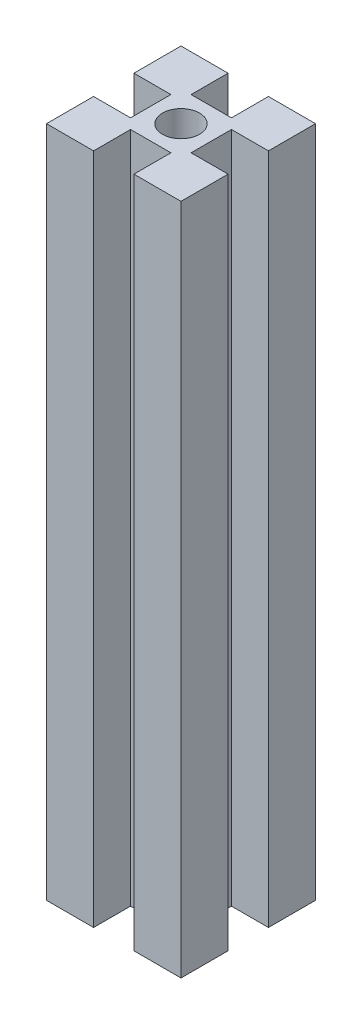
ISO-10303-21;
HEADER;
FILE_DESCRIPTION(('STEP AP214'),'2;1');
FILE_NAME('part.step','',(''),(''),'','','');
FILE_SCHEMA(('AUTOMOTIVE_DESIGN { 1 0 10303 214 1 1 1 1 }'));
ENDSEC;
DATA;
#1=APPLICATION_CONTEXT('core data for automotive mechanical design processes');
#2=APPLICATION_PROTOCOL_DEFINITION('international standard','automotive_design',2000,#1);
#3=PRODUCT_CONTEXT('',#1,'mechanical');
#4=PRODUCT('Part','Part','',(#3));
#5=PRODUCT_RELATED_PRODUCT_CATEGORY('part','',(#4));
#6=PRODUCT_DEFINITION_FORMATION('','',#4);
#7=PRODUCT_DEFINITION_CONTEXT('part definition',#1,'design');
#8=PRODUCT_DEFINITION('design','',#6,#7);
#9=PRODUCT_DEFINITION_SHAPE('','',#8);
#10=(LENGTH_UNIT() NAMED_UNIT(*) SI_UNIT(.MILLI.,.METRE.));
#11=(NAMED_UNIT(*) PLANE_ANGLE_UNIT() SI_UNIT($,.RADIAN.));
#12=(NAMED_UNIT(*) SI_UNIT($,.STERADIAN.) SOLID_ANGLE_UNIT());
#13=UNCERTAINTY_MEASURE_WITH_UNIT(LENGTH_MEASURE(1.E-05),#10,'distance_accuracy_value','');
#14=(GEOMETRIC_REPRESENTATION_CONTEXT(3) GLOBAL_UNCERTAINTY_ASSIGNED_CONTEXT((#13)) GLOBAL_UNIT_ASSIGNED_CONTEXT((#10,
#11,#12)) REPRESENTATION_CONTEXT('',''));
#15=CARTESIAN_POINT('',(0.,0.,0.));
#16=DIRECTION('',(0.,0.,1.));
#17=DIRECTION('',(1.,0.,0.));
#18=AXIS2_PLACEMENT_3D('',#15,#16,#17);
#19=CARTESIAN_POINT('',(-10.,100.,10.));
#20=DIRECTION('',(1.,0.,0.));
#21=DIRECTION('',(0.,0.,-1.));
#22=AXIS2_PLACEMENT_3D('',#19,#20,#21);
#23=PLANE('',#22);
#24=DIRECTION('',(0.,0.,1.));
#25=VECTOR('',#24,1.);
#26=CARTESIAN_POINT('',(-10.,100.,10.));
#27=LINE('',#26,#25);
#28=CARTESIAN_POINT('',(-10.,100.,3.));
#29=VERTEX_POINT('',#28);
#30=CARTESIAN_POINT('',(-10.,100.,10.));
#31=VERTEX_POINT('',#30);
#32=EDGE_CURVE('E294',#29,#31,#27,.T.);
#33=ORIENTED_EDGE('',*,*,#32,.F.);
#34=DIRECTION('',(0.,1.,0.));
#35=VECTOR('',#34,1.);
#36=CARTESIAN_POINT('',(-10.,0.,3.));
#37=LINE('',#36,#35);
#38=CARTESIAN_POINT('',(-10.,0.,3.));
#39=VERTEX_POINT('',#38);
#40=EDGE_CURVE('E202',#39,#29,#37,.T.);
#41=ORIENTED_EDGE('',*,*,#40,.F.);
#42=DIRECTION('',(0.,0.,1.));
#43=VECTOR('',#42,1.);
#44=CARTESIAN_POINT('',(-10.,0.,10.));
#45=LINE('',#44,#43);
#46=CARTESIAN_POINT('',(-10.,0.,10.));
#47=VERTEX_POINT('',#46);
#48=EDGE_CURVE('E287',#39,#47,#45,.T.);
#49=ORIENTED_EDGE('',*,*,#48,.T.);
#50=DIRECTION('',(0.,-1.,0.));
#51=VECTOR('',#50,1.);
#52=CARTESIAN_POINT('',(-10.,100.,10.));
#53=LINE('',#52,#51);
#54=EDGE_CURVE('E11',#31,#47,#53,.T.);
#55=ORIENTED_EDGE('',*,*,#54,.F.);
#56=EDGE_LOOP('',(#33,#41,#49,#55));
#57=FACE_BOUND('',#56,.T.);
#58=ADVANCED_FACE('F32',(#57),#23,.F.);
#59=CARTESIAN_POINT('',(10.,100.,10.));
#60=DIRECTION('',(0.,0.,-1.));
#61=DIRECTION('',(-1.,0.,0.));
#62=AXIS2_PLACEMENT_3D('',#59,#60,#61);
#63=PLANE('',#62);
#64=DIRECTION('',(1.,0.,0.));
#65=VECTOR('',#64,1.);
#66=CARTESIAN_POINT('',(10.,100.,10.));
#67=LINE('',#66,#65);
#68=CARTESIAN_POINT('',(3.,100.,10.));
#69=VERTEX_POINT('',#68);
#70=CARTESIAN_POINT('',(10.,100.,10.));
#71=VERTEX_POINT('',#70);
#72=EDGE_CURVE('E293',#69,#71,#67,.T.);
#73=ORIENTED_EDGE('',*,*,#72,.F.);
#74=DIRECTION('',(0.,1.,0.));
#75=VECTOR('',#74,1.);
#76=CARTESIAN_POINT('',(3.,0.,10.));
#77=LINE('',#76,#75);
#78=CARTESIAN_POINT('',(3.,0.,10.));
#79=VERTEX_POINT('',#78);
#80=EDGE_CURVE('E204',#79,#69,#77,.T.);
#81=ORIENTED_EDGE('',*,*,#80,.F.);
#82=DIRECTION('',(1.,0.,0.));
#83=VECTOR('',#82,1.);
#84=CARTESIAN_POINT('',(10.,0.,10.));
#85=LINE('',#84,#83);
#86=CARTESIAN_POINT('',(10.,0.,10.));
#87=VERTEX_POINT('',#86);
#88=EDGE_CURVE('E194',#79,#87,#85,.T.);
#89=ORIENTED_EDGE('',*,*,#88,.T.);
#90=DIRECTION('',(0.,-1.,0.));
#91=VECTOR('',#90,1.);
#92=CARTESIAN_POINT('',(10.,100.,10.));
#93=LINE('',#92,#91);
#94=EDGE_CURVE('E40',#71,#87,#93,.T.);
#95=ORIENTED_EDGE('',*,*,#94,.F.);
#96=EDGE_LOOP('',(#73,#81,#89,#95));
#97=FACE_BOUND('',#96,.T.);
#98=ADVANCED_FACE('F343',(#97),#63,.F.);
#99=CARTESIAN_POINT('',(10.,100.,10.));
#100=DIRECTION('',(-1.,0.,0.));
#101=DIRECTION('',(0.,0.,1.));
#102=AXIS2_PLACEMENT_3D('',#99,#100,#101);
#103=PLANE('',#102);
#104=DIRECTION('',(0.,0.,-1.));
#105=VECTOR('',#104,1.);
#106=CARTESIAN_POINT('',(10.,100.,10.));
#107=LINE('',#106,#105);
#108=CARTESIAN_POINT('',(10.,100.,-3.));
#109=VERTEX_POINT('',#108);
#110=CARTESIAN_POINT('',(10.,100.,-10.));
#111=VERTEX_POINT('',#110);
#112=EDGE_CURVE('E298',#109,#111,#107,.T.);
#113=ORIENTED_EDGE('',*,*,#112,.F.);
#114=DIRECTION('',(0.,1.,0.));
#115=VECTOR('',#114,1.);
#116=CARTESIAN_POINT('',(10.,0.,-3.));
#117=LINE('',#116,#115);
#118=CARTESIAN_POINT('',(10.,0.,-3.));
#119=VERTEX_POINT('',#118);
#120=EDGE_CURVE('E249',#119,#109,#117,.T.);
#121=ORIENTED_EDGE('',*,*,#120,.F.);
#122=DIRECTION('',(0.,0.,-1.));
#123=VECTOR('',#122,1.);
#124=CARTESIAN_POINT('',(10.,0.,10.));
#125=LINE('',#124,#123);
#126=CARTESIAN_POINT('',(10.,0.,-10.));
#127=VERTEX_POINT('',#126);
#128=EDGE_CURVE('E313',#119,#127,#125,.T.);
#129=ORIENTED_EDGE('',*,*,#128,.T.);
#130=DIRECTION('',(0.,-1.,0.));
#131=VECTOR('',#130,1.);
#132=CARTESIAN_POINT('',(10.,100.,-10.));
#133=LINE('',#132,#131);
#134=EDGE_CURVE('E323',#111,#127,#133,.T.);
#135=ORIENTED_EDGE('',*,*,#134,.F.);
#136=EDGE_LOOP('',(#113,#121,#129,#135));
#137=FACE_BOUND('',#136,.T.);
#138=ADVANCED_FACE('F345',(#137),#103,.F.);
#139=CARTESIAN_POINT('',(10.,100.,-10.));
#140=DIRECTION('',(0.,0.,1.));
#141=DIRECTION('',(1.,0.,0.));
#142=AXIS2_PLACEMENT_3D('',#139,#140,#141);
#143=PLANE('',#142);
#144=DIRECTION('',(-1.,0.,0.));
#145=VECTOR('',#144,1.);
#146=CARTESIAN_POINT('',(10.,100.,-10.));
#147=LINE('',#146,#145);
#148=CARTESIAN_POINT('',(-3.,100.,-10.));
#149=VERTEX_POINT('',#148);
#150=CARTESIAN_POINT('',(-10.,100.,-10.));
#151=VERTEX_POINT('',#150);
#152=EDGE_CURVE('E302',#149,#151,#147,.T.);
#153=ORIENTED_EDGE('',*,*,#152,.F.);
#154=DIRECTION('',(0.,1.,0.));
#155=VECTOR('',#154,1.);
#156=CARTESIAN_POINT('',(-3.,0.,-10.));
#157=LINE('',#156,#155);
#158=CARTESIAN_POINT('',(-3.,0.,-10.));
#159=VERTEX_POINT('',#158);
#160=EDGE_CURVE('E253',#159,#149,#157,.T.);
#161=ORIENTED_EDGE('',*,*,#160,.F.);
#162=DIRECTION('',(-1.,0.,0.));
#163=VECTOR('',#162,1.);
#164=CARTESIAN_POINT('',(10.,0.,-10.));
#165=LINE('',#164,#163);
#166=CARTESIAN_POINT('',(-10.,0.,-10.));
#167=VERTEX_POINT('',#166);
#168=EDGE_CURVE('E317',#159,#167,#165,.T.);
#169=ORIENTED_EDGE('',*,*,#168,.T.);
#170=DIRECTION('',(0.,-1.,0.));
#171=VECTOR('',#170,1.);
#172=CARTESIAN_POINT('',(-10.,100.,-10.));
#173=LINE('',#172,#171);
#174=EDGE_CURVE('E306',#151,#167,#173,.T.);
#175=ORIENTED_EDGE('',*,*,#174,.F.);
#176=EDGE_LOOP('',(#153,#161,#169,#175));
#177=FACE_BOUND('',#176,.T.);
#178=ADVANCED_FACE('F351',(#177),#143,.F.);
#179=CARTESIAN_POINT('',(-10.,0.,-3.));
#180=VERTEX_POINT('',#179);
#181=EDGE_CURVE('E307',#167,#180,#45,.T.);
#182=ORIENTED_EDGE('',*,*,#181,.T.);
#183=DIRECTION('',(0.,1.,0.));
#184=VECTOR('',#183,1.);
#185=CARTESIAN_POINT('',(-10.,0.,-3.));
#186=LINE('',#185,#184);
#187=CARTESIAN_POINT('',(-10.,100.,-3.));
#188=VERTEX_POINT('',#187);
#189=EDGE_CURVE('E230',#180,#188,#186,.T.);
#190=ORIENTED_EDGE('',*,*,#189,.T.);
#191=EDGE_CURVE('E290',#151,#188,#27,.T.);
#192=ORIENTED_EDGE('',*,*,#191,.F.);
#193=ORIENTED_EDGE('',*,*,#174,.T.);
#194=EDGE_LOOP('',(#182,#190,#192,#193));
#195=FACE_BOUND('',#194,.T.);
#196=ADVANCED_FACE('F34',(#195),#23,.F.);
#197=CARTESIAN_POINT('',(-3.,0.,10.));
#198=VERTEX_POINT('',#197);
#199=EDGE_CURVE('E310',#47,#198,#85,.T.);
#200=ORIENTED_EDGE('',*,*,#199,.T.);
#201=DIRECTION('',(0.,1.,0.));
#202=VECTOR('',#201,1.);
#203=CARTESIAN_POINT('',(-3.,0.,10.));
#204=LINE('',#203,#202);
#205=CARTESIAN_POINT('',(-3.,100.,10.));
#206=VERTEX_POINT('',#205);
#207=EDGE_CURVE('E207',#198,#206,#204,.T.);
#208=ORIENTED_EDGE('',*,*,#207,.T.);
#209=EDGE_CURVE('E295',#31,#206,#67,.T.);
#210=ORIENTED_EDGE('',*,*,#209,.F.);
#211=ORIENTED_EDGE('',*,*,#54,.T.);
#212=EDGE_LOOP('',(#200,#208,#210,#211));
#213=FACE_BOUND('',#212,.T.);
#214=ADVANCED_FACE('F346',(#213),#63,.F.);
#215=CARTESIAN_POINT('',(10.,0.,3.));
#216=VERTEX_POINT('',#215);
#217=EDGE_CURVE('E314',#87,#216,#125,.T.);
#218=ORIENTED_EDGE('',*,*,#217,.T.);
#219=DIRECTION('',(0.,1.,0.));
#220=VECTOR('',#219,1.);
#221=CARTESIAN_POINT('',(10.,0.,3.));
#222=LINE('',#221,#220);
#223=CARTESIAN_POINT('',(10.,100.,3.));
#224=VERTEX_POINT('',#223);
#225=EDGE_CURVE('E278',#216,#224,#222,.T.);
#226=ORIENTED_EDGE('',*,*,#225,.T.);
#227=EDGE_CURVE('E299',#71,#224,#107,.T.);
#228=ORIENTED_EDGE('',*,*,#227,.F.);
#229=ORIENTED_EDGE('',*,*,#94,.T.);
#230=EDGE_LOOP('',(#218,#226,#228,#229));
#231=FACE_BOUND('',#230,.T.);
#232=ADVANCED_FACE('F329',(#231),#103,.F.);
#233=CARTESIAN_POINT('',(3.,0.,-10.));
#234=VERTEX_POINT('',#233);
#235=EDGE_CURVE('E318',#127,#234,#165,.T.);
#236=ORIENTED_EDGE('',*,*,#235,.T.);
#237=DIRECTION('',(0.,1.,0.));
#238=VECTOR('',#237,1.);
#239=CARTESIAN_POINT('',(3.,0.,-10.));
#240=LINE('',#239,#238);
#241=CARTESIAN_POINT('',(3.,100.,-10.));
#242=VERTEX_POINT('',#241);
#243=EDGE_CURVE('E256',#234,#242,#240,.T.);
#244=ORIENTED_EDGE('',*,*,#243,.T.);
#245=EDGE_CURVE('E303',#111,#242,#147,.T.);
#246=ORIENTED_EDGE('',*,*,#245,.F.);
#247=ORIENTED_EDGE('',*,*,#134,.T.);
#248=EDGE_LOOP('',(#236,#244,#246,#247));
#249=FACE_BOUND('',#248,.T.);
#250=ADVANCED_FACE('F361',(#249),#143,.F.);
#251=CARTESIAN_POINT('',(0.,100.,0.));
#252=DIRECTION('',(0.,1.,0.));
#253=DIRECTION('',(0.,0.,1.));
#254=AXIS2_PLACEMENT_3D('',#251,#252,#253);
#255=PLANE('',#254);
#256=DIRECTION('',(0.,0.,1.));
#257=VECTOR('',#256,1.);
#258=CARTESIAN_POINT('',(-3.,100.,-10.));
#259=LINE('',#258,#257);
#260=CARTESIAN_POINT('',(-3.,100.,-4.5));
#261=VERTEX_POINT('',#260);
#262=EDGE_CURVE('E245',#149,#261,#259,.T.);
#263=ORIENTED_EDGE('',*,*,#262,.F.);
#264=ORIENTED_EDGE('',*,*,#152,.T.);
#265=ORIENTED_EDGE('',*,*,#191,.T.);
#266=DIRECTION('',(-1.,0.,0.));
#267=VECTOR('',#266,1.);
#268=CARTESIAN_POINT('',(-10.,100.,-3.));
#269=LINE('',#268,#267);
#270=CARTESIAN_POINT('',(-4.5,100.,-3.));
#271=VERTEX_POINT('',#270);
#272=EDGE_CURVE('E215',#271,#188,#269,.T.);
#273=ORIENTED_EDGE('',*,*,#272,.F.);
#274=DIRECTION('',(0.,0.,-1.));
#275=VECTOR('',#274,1.);
#276=CARTESIAN_POINT('',(-4.5,100.,3.));
#277=LINE('',#276,#275);
#278=CARTESIAN_POINT('',(-4.5,100.,3.));
#279=VERTEX_POINT('',#278);
#280=EDGE_CURVE('E225',#279,#271,#277,.T.);
#281=ORIENTED_EDGE('',*,*,#280,.F.);
#282=DIRECTION('',(1.,0.,0.));
#283=VECTOR('',#282,1.);
#284=CARTESIAN_POINT('',(-10.,100.,3.));
#285=LINE('',#284,#283);
#286=EDGE_CURVE('E222',#29,#279,#285,.T.);
#287=ORIENTED_EDGE('',*,*,#286,.F.);
#288=ORIENTED_EDGE('',*,*,#32,.T.);
#289=ORIENTED_EDGE('',*,*,#209,.T.);
#290=DIRECTION('',(0.,0.,1.));
#291=VECTOR('',#290,1.);
#292=CARTESIAN_POINT('',(-3.,100.,10.));
#293=LINE('',#292,#291);
#294=CARTESIAN_POINT('',(-3.,100.,4.5));
#295=VERTEX_POINT('',#294);
#296=EDGE_CURVE('E195',#295,#206,#293,.T.);
#297=ORIENTED_EDGE('',*,*,#296,.F.);
#298=DIRECTION('',(-1.,0.,0.));
#299=VECTOR('',#298,1.);
#300=CARTESIAN_POINT('',(3.,100.,4.5));
#301=LINE('',#300,#299);
#302=CARTESIAN_POINT('',(3.,100.,4.5));
#303=VERTEX_POINT('',#302);
#304=EDGE_CURVE('E197',#303,#295,#301,.T.);
#305=ORIENTED_EDGE('',*,*,#304,.F.);
#306=DIRECTION('',(0.,0.,-1.));
#307=VECTOR('',#306,1.);
#308=CARTESIAN_POINT('',(3.,100.,10.));
#309=LINE('',#308,#307);
#310=EDGE_CURVE('E175',#69,#303,#309,.T.);
#311=ORIENTED_EDGE('',*,*,#310,.F.);
#312=ORIENTED_EDGE('',*,*,#72,.T.);
#313=ORIENTED_EDGE('',*,*,#227,.T.);
#314=DIRECTION('',(1.,0.,0.));
#315=VECTOR('',#314,1.);
#316=CARTESIAN_POINT('',(10.,100.,3.));
#317=LINE('',#316,#315);
#318=CARTESIAN_POINT('',(4.5,100.,3.));
#319=VERTEX_POINT('',#318);
#320=EDGE_CURVE('E266',#319,#224,#317,.T.);
#321=ORIENTED_EDGE('',*,*,#320,.F.);
#322=DIRECTION('',(0.,0.,1.));
#323=VECTOR('',#322,1.);
#324=CARTESIAN_POINT('',(4.5,100.,-3.));
#325=LINE('',#324,#323);
#326=CARTESIAN_POINT('',(4.5,100.,-3.));
#327=VERTEX_POINT('',#326);
#328=EDGE_CURVE('E273',#327,#319,#325,.T.);
#329=ORIENTED_EDGE('',*,*,#328,.F.);
#330=DIRECTION('',(-1.,0.,0.));
#331=VECTOR('',#330,1.);
#332=CARTESIAN_POINT('',(10.,100.,-3.));
#333=LINE('',#332,#331);
#334=EDGE_CURVE('E206',#109,#327,#333,.T.);
#335=ORIENTED_EDGE('',*,*,#334,.F.);
#336=ORIENTED_EDGE('',*,*,#112,.T.);
#337=ORIENTED_EDGE('',*,*,#245,.T.);
#338=DIRECTION('',(0.,0.,-1.));
#339=VECTOR('',#338,1.);
#340=CARTESIAN_POINT('',(3.,100.,-10.));
#341=LINE('',#340,#339);
#342=CARTESIAN_POINT('',(3.,100.,-4.5));
#343=VERTEX_POINT('',#342);
#344=EDGE_CURVE('E240',#343,#242,#341,.T.);
#345=ORIENTED_EDGE('',*,*,#344,.F.);
#346=DIRECTION('',(1.,0.,0.));
#347=VECTOR('',#346,1.);
#348=CARTESIAN_POINT('',(-3.,100.,-4.5));
#349=LINE('',#348,#347);
#350=EDGE_CURVE('E248',#261,#343,#349,.T.);
#351=ORIENTED_EDGE('',*,*,#350,.F.);
#352=EDGE_LOOP('',(#263,#264,#265,#273,#281,#287,#288,#289,#297,#305,#311,#312,#313,#321,#329,
#335,#336,#337,#345,#351));
#353=FACE_BOUND('',#352,.T.);
#354=CARTESIAN_POINT('',(0.,100.,0.));
#355=DIRECTION('',(0.,1.,0.));
#356=DIRECTION('',(0.,0.,1.));
#357=AXIS2_PLACEMENT_3D('',#354,#355,#356);
#358=CIRCLE('',#357,2.75);
#359=CARTESIAN_POINT('',(0.,100.,2.75));
#360=VERTEX_POINT('',#359);
#361=EDGE_CURVE('E255',#360,#360,#358,.T.);
#362=ORIENTED_EDGE('',*,*,#361,.F.);
#363=EDGE_LOOP('',(#362));
#364=FACE_BOUND('',#363,.T.);
#365=ADVANCED_FACE('F341',(#353,#364),#255,.T.);
#366=CARTESIAN_POINT('',(0.,0.,0.));
#367=DIRECTION('',(0.,1.,0.));
#368=DIRECTION('',(0.,0.,1.));
#369=AXIS2_PLACEMENT_3D('',#366,#367,#368);
#370=PLANE('',#369);
#371=ORIENTED_EDGE('',*,*,#168,.F.);
#372=DIRECTION('',(0.,0.,1.));
#373=VECTOR('',#372,1.);
#374=CARTESIAN_POINT('',(-3.,0.,-10.));
#375=LINE('',#374,#373);
#376=CARTESIAN_POINT('',(-3.,0.,-4.5));
#377=VERTEX_POINT('',#376);
#378=EDGE_CURVE('E236',#159,#377,#375,.T.);
#379=ORIENTED_EDGE('',*,*,#378,.T.);
#380=DIRECTION('',(1.,0.,0.));
#381=VECTOR('',#380,1.);
#382=CARTESIAN_POINT('',(-3.,0.,-4.5));
#383=LINE('',#382,#381);
#384=CARTESIAN_POINT('',(3.,0.,-4.5));
#385=VERTEX_POINT('',#384);
#386=EDGE_CURVE('E239',#377,#385,#383,.T.);
#387=ORIENTED_EDGE('',*,*,#386,.T.);
#388=DIRECTION('',(0.,0.,-1.));
#389=VECTOR('',#388,1.);
#390=CARTESIAN_POINT('',(3.,0.,-10.));
#391=LINE('',#390,#389);
#392=EDGE_CURVE('E47',#385,#234,#391,.T.);
#393=ORIENTED_EDGE('',*,*,#392,.T.);
#394=ORIENTED_EDGE('',*,*,#235,.F.);
#395=ORIENTED_EDGE('',*,*,#128,.F.);
#396=DIRECTION('',(-1.,0.,0.));
#397=VECTOR('',#396,1.);
#398=CARTESIAN_POINT('',(10.,0.,-3.));
#399=LINE('',#398,#397);
#400=CARTESIAN_POINT('',(4.5,0.,-3.));
#401=VERTEX_POINT('',#400);
#402=EDGE_CURVE('E262',#119,#401,#399,.T.);
#403=ORIENTED_EDGE('',*,*,#402,.T.);
#404=DIRECTION('',(0.,0.,1.));
#405=VECTOR('',#404,1.);
#406=CARTESIAN_POINT('',(4.5,0.,-3.));
#407=LINE('',#406,#405);
#408=CARTESIAN_POINT('',(4.5,0.,3.));
#409=VERTEX_POINT('',#408);
#410=EDGE_CURVE('E265',#401,#409,#407,.T.);
#411=ORIENTED_EDGE('',*,*,#410,.T.);
#412=DIRECTION('',(1.,0.,0.));
#413=VECTOR('',#412,1.);
#414=CARTESIAN_POINT('',(10.,0.,3.));
#415=LINE('',#414,#413);
#416=EDGE_CURVE('E55',#409,#216,#415,.T.);
#417=ORIENTED_EDGE('',*,*,#416,.T.);
#418=ORIENTED_EDGE('',*,*,#217,.F.);
#419=ORIENTED_EDGE('',*,*,#88,.F.);
#420=DIRECTION('',(0.,0.,-1.));
#421=VECTOR('',#420,1.);
#422=CARTESIAN_POINT('',(3.,0.,10.));
#423=LINE('',#422,#421);
#424=CARTESIAN_POINT('',(3.,0.,4.5));
#425=VERTEX_POINT('',#424);
#426=EDGE_CURVE('E172',#79,#425,#423,.T.);
#427=ORIENTED_EDGE('',*,*,#426,.T.);
#428=DIRECTION('',(-1.,0.,0.));
#429=VECTOR('',#428,1.);
#430=CARTESIAN_POINT('',(3.,0.,4.5));
#431=LINE('',#430,#429);
#432=CARTESIAN_POINT('',(-3.,0.,4.5));
#433=VERTEX_POINT('',#432);
#434=EDGE_CURVE('E184',#425,#433,#431,.T.);
#435=ORIENTED_EDGE('',*,*,#434,.T.);
#436=DIRECTION('',(0.,0.,1.));
#437=VECTOR('',#436,1.);
#438=CARTESIAN_POINT('',(-3.,0.,10.));
#439=LINE('',#438,#437);
#440=EDGE_CURVE('E180',#433,#198,#439,.T.);
#441=ORIENTED_EDGE('',*,*,#440,.T.);
#442=ORIENTED_EDGE('',*,*,#199,.F.);
#443=ORIENTED_EDGE('',*,*,#48,.F.);
#444=DIRECTION('',(1.,0.,0.));
#445=VECTOR('',#444,1.);
#446=CARTESIAN_POINT('',(-10.,0.,3.));
#447=LINE('',#446,#445);
#448=CARTESIAN_POINT('',(-4.5,0.,3.));
#449=VERTEX_POINT('',#448);
#450=EDGE_CURVE('E211',#39,#449,#447,.T.);
#451=ORIENTED_EDGE('',*,*,#450,.T.);
#452=DIRECTION('',(0.,0.,-1.));
#453=VECTOR('',#452,1.);
#454=CARTESIAN_POINT('',(-4.5,0.,3.));
#455=LINE('',#454,#453);
#456=CARTESIAN_POINT('',(-4.5,0.,-3.));
#457=VERTEX_POINT('',#456);
#458=EDGE_CURVE('E214',#449,#457,#455,.T.);
#459=ORIENTED_EDGE('',*,*,#458,.T.);
#460=DIRECTION('',(-1.,0.,0.));
#461=VECTOR('',#460,1.);
#462=CARTESIAN_POINT('',(-10.,0.,-3.));
#463=LINE('',#462,#461);
#464=EDGE_CURVE('E218',#457,#180,#463,.T.);
#465=ORIENTED_EDGE('',*,*,#464,.T.);
#466=ORIENTED_EDGE('',*,*,#181,.F.);
#467=EDGE_LOOP('',(#371,#379,#387,#393,#394,#395,#403,#411,#417,#418,#419,#427,#435,#441,#442,
#443,#451,#459,#465,#466));
#468=FACE_BOUND('',#467,.T.);
#469=CARTESIAN_POINT('',(0.,0.,0.));
#470=DIRECTION('',(0.,1.,0.));
#471=DIRECTION('',(0.,0.,1.));
#472=AXIS2_PLACEMENT_3D('',#469,#470,#471);
#473=CIRCLE('',#472,2.75);
#474=CARTESIAN_POINT('',(0.,0.,2.75));
#475=VERTEX_POINT('',#474);
#476=EDGE_CURVE('E284',#475,#475,#473,.T.);
#477=ORIENTED_EDGE('',*,*,#476,.T.);
#478=EDGE_LOOP('',(#477));
#479=FACE_BOUND('',#478,.T.);
#480=ADVANCED_FACE('F191',(#468,#479),#370,.F.);
#481=CARTESIAN_POINT('',(0.,0.,0.));
#482=DIRECTION('',(0.,1.,0.));
#483=DIRECTION('',(0.,0.,1.));
#484=AXIS2_PLACEMENT_3D('',#481,#482,#483);
#485=CYLINDRICAL_SURFACE('',#484,2.75);
#486=ORIENTED_EDGE('',*,*,#476,.F.);
#487=EDGE_LOOP('',(#486));
#488=FACE_BOUND('',#487,.T.);
#489=ORIENTED_EDGE('',*,*,#361,.T.);
#490=EDGE_LOOP('',(#489));
#491=FACE_BOUND('',#490,.T.);
#492=ADVANCED_FACE('F415',(#488,#491),#485,.F.);
#493=CARTESIAN_POINT('',(-10.,0.,3.));
#494=DIRECTION('',(0.,0.,1.));
#495=DIRECTION('',(1.,0.,0.));
#496=AXIS2_PLACEMENT_3D('',#493,#494,#495);
#497=PLANE('',#496);
#498=ORIENTED_EDGE('',*,*,#286,.T.);
#499=DIRECTION('',(0.,1.,0.));
#500=VECTOR('',#499,1.);
#501=CARTESIAN_POINT('',(-4.5,0.,3.));
#502=LINE('',#501,#500);
#503=EDGE_CURVE('E221',#449,#279,#502,.T.);
#504=ORIENTED_EDGE('',*,*,#503,.F.);
#505=ORIENTED_EDGE('',*,*,#450,.F.);
#506=ORIENTED_EDGE('',*,*,#40,.T.);
#507=EDGE_LOOP('',(#498,#504,#505,#506));
#508=FACE_BOUND('',#507,.T.);
#509=ADVANCED_FACE('F374',(#508),#497,.F.);
#510=CARTESIAN_POINT('',(-10.,0.,-3.));
#511=DIRECTION('',(0.,0.,-1.));
#512=DIRECTION('',(-1.,0.,0.));
#513=AXIS2_PLACEMENT_3D('',#510,#511,#512);
#514=PLANE('',#513);
#515=ORIENTED_EDGE('',*,*,#272,.T.);
#516=ORIENTED_EDGE('',*,*,#189,.F.);
#517=ORIENTED_EDGE('',*,*,#464,.F.);
#518=DIRECTION('',(0.,1.,0.));
#519=VECTOR('',#518,1.);
#520=CARTESIAN_POINT('',(-4.5,0.,-3.));
#521=LINE('',#520,#519);
#522=EDGE_CURVE('E233',#457,#271,#521,.T.);
#523=ORIENTED_EDGE('',*,*,#522,.T.);
#524=EDGE_LOOP('',(#515,#516,#517,#523));
#525=FACE_BOUND('',#524,.T.);
#526=ADVANCED_FACE('F477',(#525),#514,.F.);
#527=CARTESIAN_POINT('',(-4.5,0.,3.));
#528=DIRECTION('',(1.,0.,0.));
#529=DIRECTION('',(0.,0.,-1.));
#530=AXIS2_PLACEMENT_3D('',#527,#528,#529);
#531=PLANE('',#530);
#532=ORIENTED_EDGE('',*,*,#280,.T.);
#533=ORIENTED_EDGE('',*,*,#522,.F.);
#534=ORIENTED_EDGE('',*,*,#458,.F.);
#535=ORIENTED_EDGE('',*,*,#503,.T.);
#536=EDGE_LOOP('',(#532,#533,#534,#535));
#537=FACE_BOUND('',#536,.T.);
#538=ADVANCED_FACE('F379',(#537),#531,.F.);
#539=CARTESIAN_POINT('',(3.,0.,10.));
#540=DIRECTION('',(1.,0.,0.));
#541=DIRECTION('',(0.,0.,-1.));
#542=AXIS2_PLACEMENT_3D('',#539,#540,#541);
#543=PLANE('',#542);
#544=ORIENTED_EDGE('',*,*,#310,.T.);
#545=DIRECTION('',(0.,1.,0.));
#546=VECTOR('',#545,1.);
#547=CARTESIAN_POINT('',(3.,0.,4.5));
#548=LINE('',#547,#546);
#549=EDGE_CURVE('E168',#425,#303,#548,.T.);
#550=ORIENTED_EDGE('',*,*,#549,.F.);
#551=ORIENTED_EDGE('',*,*,#426,.F.);
#552=ORIENTED_EDGE('',*,*,#80,.T.);
#553=EDGE_LOOP('',(#544,#550,#551,#552));
#554=FACE_BOUND('',#553,.T.);
#555=ADVANCED_FACE('F170',(#554),#543,.F.);
#556=CARTESIAN_POINT('',(-3.,0.,10.));
#557=DIRECTION('',(-1.,0.,0.));
#558=DIRECTION('',(0.,0.,1.));
#559=AXIS2_PLACEMENT_3D('',#556,#557,#558);
#560=PLANE('',#559);
#561=ORIENTED_EDGE('',*,*,#296,.T.);
#562=ORIENTED_EDGE('',*,*,#207,.F.);
#563=ORIENTED_EDGE('',*,*,#440,.F.);
#564=DIRECTION('',(0.,1.,0.));
#565=VECTOR('',#564,1.);
#566=CARTESIAN_POINT('',(-3.,0.,4.5));
#567=LINE('',#566,#565);
#568=EDGE_CURVE('E179',#433,#295,#567,.T.);
#569=ORIENTED_EDGE('',*,*,#568,.T.);
#570=EDGE_LOOP('',(#561,#562,#563,#569));
#571=FACE_BOUND('',#570,.T.);
#572=ADVANCED_FACE('F368',(#571),#560,.F.);
#573=CARTESIAN_POINT('',(3.,0.,4.5));
#574=DIRECTION('',(0.,0.,-1.));
#575=DIRECTION('',(-1.,0.,0.));
#576=AXIS2_PLACEMENT_3D('',#573,#574,#575);
#577=PLANE('',#576);
#578=ORIENTED_EDGE('',*,*,#304,.T.);
#579=ORIENTED_EDGE('',*,*,#568,.F.);
#580=ORIENTED_EDGE('',*,*,#434,.F.);
#581=ORIENTED_EDGE('',*,*,#549,.T.);
#582=EDGE_LOOP('',(#578,#579,#580,#581));
#583=FACE_BOUND('',#582,.T.);
#584=ADVANCED_FACE('F185',(#583),#577,.F.);
#585=CARTESIAN_POINT('',(10.,0.,-3.));
#586=DIRECTION('',(0.,0.,-1.));
#587=DIRECTION('',(-1.,0.,0.));
#588=AXIS2_PLACEMENT_3D('',#585,#586,#587);
#589=PLANE('',#588);
#590=ORIENTED_EDGE('',*,*,#334,.T.);
#591=DIRECTION('',(0.,1.,0.));
#592=VECTOR('',#591,1.);
#593=CARTESIAN_POINT('',(4.5,0.,-3.));
#594=LINE('',#593,#592);
#595=EDGE_CURVE('E270',#401,#327,#594,.T.);
#596=ORIENTED_EDGE('',*,*,#595,.F.);
#597=ORIENTED_EDGE('',*,*,#402,.F.);
#598=ORIENTED_EDGE('',*,*,#120,.T.);
#599=EDGE_LOOP('',(#590,#596,#597,#598));
#600=FACE_BOUND('',#599,.T.);
#601=ADVANCED_FACE('F404',(#600),#589,.F.);
#602=CARTESIAN_POINT('',(10.,0.,3.));
#603=DIRECTION('',(0.,0.,1.));
#604=DIRECTION('',(1.,0.,0.));
#605=AXIS2_PLACEMENT_3D('',#602,#603,#604);
#606=PLANE('',#605);
#607=ORIENTED_EDGE('',*,*,#320,.T.);
#608=ORIENTED_EDGE('',*,*,#225,.F.);
#609=ORIENTED_EDGE('',*,*,#416,.F.);
#610=DIRECTION('',(0.,1.,0.));
#611=VECTOR('',#610,1.);
#612=CARTESIAN_POINT('',(4.5,0.,3.));
#613=LINE('',#612,#611);
#614=EDGE_CURVE('E281',#409,#319,#613,.T.);
#615=ORIENTED_EDGE('',*,*,#614,.T.);
#616=EDGE_LOOP('',(#607,#608,#609,#615));
#617=FACE_BOUND('',#616,.T.);
#618=ADVANCED_FACE('F338',(#617),#606,.F.);
#619=CARTESIAN_POINT('',(4.5,0.,-3.));
#620=DIRECTION('',(-1.,0.,0.));
#621=DIRECTION('',(0.,0.,1.));
#622=AXIS2_PLACEMENT_3D('',#619,#620,#621);
#623=PLANE('',#622);
#624=ORIENTED_EDGE('',*,*,#328,.T.);
#625=ORIENTED_EDGE('',*,*,#614,.F.);
#626=ORIENTED_EDGE('',*,*,#410,.F.);
#627=ORIENTED_EDGE('',*,*,#595,.T.);
#628=EDGE_LOOP('',(#624,#625,#626,#627));
#629=FACE_BOUND('',#628,.T.);
#630=ADVANCED_FACE('F335',(#629),#623,.F.);
#631=CARTESIAN_POINT('',(-3.,0.,-10.));
#632=DIRECTION('',(-1.,0.,0.));
#633=DIRECTION('',(0.,0.,1.));
#634=AXIS2_PLACEMENT_3D('',#631,#632,#633);
#635=PLANE('',#634);
#636=ORIENTED_EDGE('',*,*,#262,.T.);
#637=DIRECTION('',(0.,1.,0.));
#638=VECTOR('',#637,1.);
#639=CARTESIAN_POINT('',(-3.,0.,-4.5));
#640=LINE('',#639,#638);
#641=EDGE_CURVE('E244',#377,#261,#640,.T.);
#642=ORIENTED_EDGE('',*,*,#641,.F.);
#643=ORIENTED_EDGE('',*,*,#378,.F.);
#644=ORIENTED_EDGE('',*,*,#160,.T.);
#645=EDGE_LOOP('',(#636,#642,#643,#644));
#646=FACE_BOUND('',#645,.T.);
#647=ADVANCED_FACE('F390',(#646),#635,.F.);
#648=CARTESIAN_POINT('',(3.,0.,-10.));
#649=DIRECTION('',(1.,0.,0.));
#650=DIRECTION('',(0.,0.,-1.));
#651=AXIS2_PLACEMENT_3D('',#648,#649,#650);
#652=PLANE('',#651);
#653=ORIENTED_EDGE('',*,*,#344,.T.);
#654=ORIENTED_EDGE('',*,*,#243,.F.);
#655=ORIENTED_EDGE('',*,*,#392,.F.);
#656=DIRECTION('',(0.,1.,0.));
#657=VECTOR('',#656,1.);
#658=CARTESIAN_POINT('',(3.,0.,-4.5));
#659=LINE('',#658,#657);
#660=EDGE_CURVE('E259',#385,#343,#659,.T.);
#661=ORIENTED_EDGE('',*,*,#660,.T.);
#662=EDGE_LOOP('',(#653,#654,#655,#661));
#663=FACE_BOUND('',#662,.T.);
#664=ADVANCED_FACE('F395',(#663),#652,.F.);
#665=CARTESIAN_POINT('',(-3.,0.,-4.5));
#666=DIRECTION('',(0.,0.,1.));
#667=DIRECTION('',(1.,0.,0.));
#668=AXIS2_PLACEMENT_3D('',#665,#666,#667);
#669=PLANE('',#668);
#670=ORIENTED_EDGE('',*,*,#350,.T.);
#671=ORIENTED_EDGE('',*,*,#660,.F.);
#672=ORIENTED_EDGE('',*,*,#386,.F.);
#673=ORIENTED_EDGE('',*,*,#641,.T.);
#674=EDGE_LOOP('',(#670,#671,#672,#673));
#675=FACE_BOUND('',#674,.T.);
#676=ADVANCED_FACE('F393',(#675),#669,.F.);
#677=CLOSED_SHELL('',(#58,#98,#138,#178,#196,#214,#232,#250,#365,#480,#492,#509,#526,#538,#555,
#572,#584,#601,#618,#630,#647,#664,#676));
#678=MANIFOLD_SOLID_BREP('B2',#677);
#679=ADVANCED_BREP_SHAPE_REPRESENTATION('',(#18,#678),#14);
#680=SHAPE_DEFINITION_REPRESENTATION(#9,#679);
ENDSEC;
END-ISO-10303-21;
